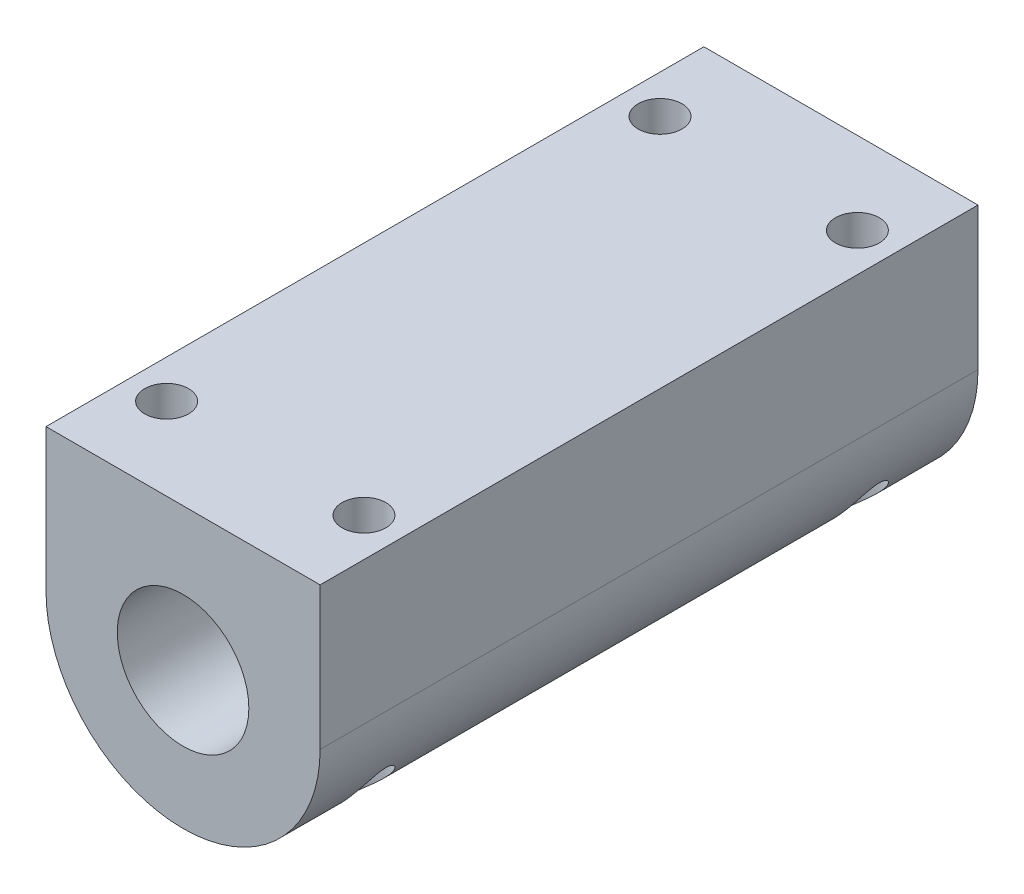
ISO-10303-21;
HEADER;
FILE_DESCRIPTION(('STEP AP214'),'2;1');
FILE_NAME('part.step','',(''),(''),'','','');
FILE_SCHEMA(('AUTOMOTIVE_DESIGN { 1 0 10303 214 1 1 1 1 }'));
ENDSEC;
DATA;
#1=APPLICATION_CONTEXT('core data for automotive mechanical design processes');
#2=APPLICATION_PROTOCOL_DEFINITION('international standard','automotive_design',2000,#1);
#3=PRODUCT_CONTEXT('',#1,'mechanical');
#4=PRODUCT('Part','Part','',(#3));
#5=PRODUCT_RELATED_PRODUCT_CATEGORY('part','',(#4));
#6=PRODUCT_DEFINITION_FORMATION('','',#4);
#7=PRODUCT_DEFINITION_CONTEXT('part definition',#1,'design');
#8=PRODUCT_DEFINITION('design','',#6,#7);
#9=PRODUCT_DEFINITION_SHAPE('','',#8);
#10=(LENGTH_UNIT() NAMED_UNIT(*) SI_UNIT(.MILLI.,.METRE.));
#11=(NAMED_UNIT(*) PLANE_ANGLE_UNIT() SI_UNIT($,.RADIAN.));
#12=(NAMED_UNIT(*) SI_UNIT($,.STERADIAN.) SOLID_ANGLE_UNIT());
#13=UNCERTAINTY_MEASURE_WITH_UNIT(LENGTH_MEASURE(1.E-05),#10,'distance_accuracy_value','');
#14=(GEOMETRIC_REPRESENTATION_CONTEXT(3) GLOBAL_UNCERTAINTY_ASSIGNED_CONTEXT((#13)) GLOBAL_UNIT_ASSIGNED_CONTEXT((#10,
#11,#12)) REPRESENTATION_CONTEXT('',''));
#15=CARTESIAN_POINT('',(0.,0.,0.));
#16=DIRECTION('',(0.,0.,1.));
#17=DIRECTION('',(1.,0.,0.));
#18=AXIS2_PLACEMENT_3D('',#15,#16,#17);
#19=CARTESIAN_POINT('',(0.,0.,60.));
#20=DIRECTION('',(0.,0.,1.));
#21=DIRECTION('',(1.,0.,0.));
#22=AXIS2_PLACEMENT_3D('',#19,#20,#21);
#23=PLANE('',#22);
#24=CARTESIAN_POINT('',(0.,0.,60.));
#25=DIRECTION('',(0.,0.,1.));
#26=DIRECTION('',(1.,0.,0.));
#27=AXIS2_PLACEMENT_3D('',#24,#25,#26);
#28=CIRCLE('',#27,12.5);
#29=CARTESIAN_POINT('',(-12.5,0.,60.));
#30=VERTEX_POINT('',#29);
#31=CARTESIAN_POINT('',(12.5,0.,60.));
#32=VERTEX_POINT('',#31);
#33=EDGE_CURVE('E85',#30,#32,#28,.T.);
#34=ORIENTED_EDGE('',*,*,#33,.T.);
#35=DIRECTION('',(0.,1.,0.));
#36=VECTOR('',#35,1.);
#37=CARTESIAN_POINT('',(12.5,13.,60.));
#38=LINE('',#37,#36);
#39=CARTESIAN_POINT('',(12.5,13.,60.));
#40=VERTEX_POINT('',#39);
#41=EDGE_CURVE('E80',#32,#40,#38,.T.);
#42=ORIENTED_EDGE('',*,*,#41,.T.);
#43=DIRECTION('',(-1.,0.,0.));
#44=VECTOR('',#43,1.);
#45=CARTESIAN_POINT('',(-12.5,13.,60.));
#46=LINE('',#45,#44);
#47=CARTESIAN_POINT('',(-12.5,13.,60.));
#48=VERTEX_POINT('',#47);
#49=EDGE_CURVE('E83',#40,#48,#46,.T.);
#50=ORIENTED_EDGE('',*,*,#49,.T.);
#51=DIRECTION('',(0.,-1.,0.));
#52=VECTOR('',#51,1.);
#53=CARTESIAN_POINT('',(-12.5,0.,60.));
#54=LINE('',#53,#52);
#55=EDGE_CURVE('E50',#48,#30,#54,.T.);
#56=ORIENTED_EDGE('',*,*,#55,.T.);
#57=EDGE_LOOP('',(#34,#42,#50,#56));
#58=FACE_BOUND('',#57,.T.);
#59=CARTESIAN_POINT('',(0.,0.,60.));
#60=DIRECTION('',(0.,0.,1.));
#61=DIRECTION('',(1.,0.,0.));
#62=AXIS2_PLACEMENT_3D('',#59,#60,#61);
#63=CIRCLE('',#62,6.);
#64=CARTESIAN_POINT('',(6.,0.,60.));
#65=VERTEX_POINT('',#64);
#66=EDGE_CURVE('E100',#65,#65,#63,.T.);
#67=ORIENTED_EDGE('',*,*,#66,.F.);
#68=EDGE_LOOP('',(#67));
#69=FACE_BOUND('',#68,.T.);
#70=ADVANCED_FACE('F32',(#58,#69),#23,.T.);
#71=CARTESIAN_POINT('',(0.,0.,0.));
#72=DIRECTION('',(0.,0.,1.));
#73=DIRECTION('',(1.,0.,0.));
#74=AXIS2_PLACEMENT_3D('',#71,#72,#73);
#75=PLANE('',#74);
#76=CARTESIAN_POINT('',(0.,0.,0.));
#77=DIRECTION('',(0.,0.,1.));
#78=DIRECTION('',(1.,0.,0.));
#79=AXIS2_PLACEMENT_3D('',#76,#77,#78);
#80=CIRCLE('',#79,12.5);
#81=CARTESIAN_POINT('',(-12.5,0.,0.));
#82=VERTEX_POINT('',#81);
#83=CARTESIAN_POINT('',(12.5,0.,0.));
#84=VERTEX_POINT('',#83);
#85=EDGE_CURVE('E97',#82,#84,#80,.T.);
#86=ORIENTED_EDGE('',*,*,#85,.F.);
#87=DIRECTION('',(0.,-1.,0.));
#88=VECTOR('',#87,1.);
#89=CARTESIAN_POINT('',(-12.5,0.,0.));
#90=LINE('',#89,#88);
#91=CARTESIAN_POINT('',(-12.5,13.,0.));
#92=VERTEX_POINT('',#91);
#93=EDGE_CURVE('E73',#92,#82,#90,.T.);
#94=ORIENTED_EDGE('',*,*,#93,.F.);
#95=DIRECTION('',(-1.,0.,0.));
#96=VECTOR('',#95,1.);
#97=CARTESIAN_POINT('',(-12.5,13.,0.));
#98=LINE('',#97,#96);
#99=CARTESIAN_POINT('',(12.5,13.,0.));
#100=VERTEX_POINT('',#99);
#101=EDGE_CURVE('E67',#100,#92,#98,.T.);
#102=ORIENTED_EDGE('',*,*,#101,.F.);
#103=DIRECTION('',(0.,1.,0.));
#104=VECTOR('',#103,1.);
#105=CARTESIAN_POINT('',(12.5,13.,0.));
#106=LINE('',#105,#104);
#107=EDGE_CURVE('E89',#84,#100,#106,.T.);
#108=ORIENTED_EDGE('',*,*,#107,.F.);
#109=EDGE_LOOP('',(#86,#94,#102,#108));
#110=FACE_BOUND('',#109,.T.);
#111=CARTESIAN_POINT('',(0.,0.,0.));
#112=DIRECTION('',(0.,0.,1.));
#113=DIRECTION('',(1.,0.,0.));
#114=AXIS2_PLACEMENT_3D('',#111,#112,#113);
#115=CIRCLE('',#114,6.);
#116=CARTESIAN_POINT('',(6.,0.,0.));
#117=VERTEX_POINT('',#116);
#118=EDGE_CURVE('E112',#117,#117,#115,.T.);
#119=ORIENTED_EDGE('',*,*,#118,.T.);
#120=EDGE_LOOP('',(#119));
#121=FACE_BOUND('',#120,.T.);
#122=ADVANCED_FACE('F108',(#110,#121),#75,.F.);
#123=CARTESIAN_POINT('',(0.,0.,60.));
#124=DIRECTION('',(0.,0.,-1.));
#125=DIRECTION('',(-1.,0.,0.));
#126=AXIS2_PLACEMENT_3D('',#123,#124,#125);
#127=CYLINDRICAL_SURFACE('',#126,12.5);
#128=CARTESIAN_POINT('',(-9.,-8.67467578644874,9.5));
#129=CARTESIAN_POINT('',(-8.88276822720846,-8.79630010605995,9.50000229512803));
#130=CARTESIAN_POINT('',(-8.76299370317165,-8.91560878418834,9.48972096332027));
#131=CARTESIAN_POINT('',(-8.52095015980995,-9.14720618643477,9.44566512384027));
#132=CARTESIAN_POINT('',(-8.39868335012853,-9.25950079835037,9.41191061706574));
#133=CARTESIAN_POINT('',(-8.17641141476483,-9.45592013115074,9.32575450178367));
#134=CARTESIAN_POINT('',(-8.07616803637957,-9.54158180236724,9.27751818677145));
#135=CARTESIAN_POINT('',(-7.88018632223849,-9.70406071034824,9.16101530606825));
#136=CARTESIAN_POINT('',(-7.78444297647673,-9.78088792761146,9.09277165890282));
#137=CARTESIAN_POINT('',(-7.61819104126559,-9.91071589020513,8.94929025082109));
#138=CARTESIAN_POINT('',(-7.54621062322196,-9.96552886500069,8.87741102448932));
#139=CARTESIAN_POINT('',(-7.41160635442053,-10.0660390033831,8.71972633580961));
#140=CARTESIAN_POINT('',(-7.34898004293253,-10.111738565446,8.63392454842392));
#141=CARTESIAN_POINT('',(-7.23614358271359,-10.1927971216739,8.44901085231138));
#142=CARTESIAN_POINT('',(-7.18602956467706,-10.2280764147214,8.3498044062846));
#143=CARTESIAN_POINT('',(-7.10229109415836,-10.2864036589674,8.1413148099223));
#144=CARTESIAN_POINT('',(-7.06865390729351,-10.3094610571883,8.03203951931132));
#145=CARTESIAN_POINT('',(-7.02361602430495,-10.3401864928202,7.82228396005547));
#146=CARTESIAN_POINT('',(-7.00987062083992,-10.3494810988241,7.72254014960467));
#147=CARTESIAN_POINT('',(-6.99759379613082,-10.3577867234859,7.52171306741573));
#148=CARTESIAN_POINT('',(-6.99905488687743,-10.3568028035132,7.42063047940983));
#149=CARTESIAN_POINT('',(-7.01644910810808,-10.3450244215283,7.22746244037671));
#150=CARTESIAN_POINT('',(-7.03136813879621,-10.3349173822996,7.135240368689));
#151=CARTESIAN_POINT('',(-7.07345285717876,-10.3061587694468,6.95504510094699));
#152=CARTESIAN_POINT('',(-7.10061810030169,-10.2875075060014,6.86707175078065));
#153=CARTESIAN_POINT('',(-7.16648996053917,-10.2417308566956,6.69573605598136));
#154=CARTESIAN_POINT('',(-7.20542244932194,-10.2144390796019,6.61250575178425));
#155=CARTESIAN_POINT('',(-7.29275884504713,-10.1522675556593,6.4542933382391));
#156=CARTESIAN_POINT('',(-7.34116525708442,-10.1173858015954,6.37931341866767));
#157=CARTESIAN_POINT('',(-7.45053002520933,-10.0371617322873,6.23178460290596));
#158=CARTESIAN_POINT('',(-7.51225047896427,-9.99113292747637,6.16017708274989));
#159=CARTESIAN_POINT('',(-7.64217028192239,-9.89211457976818,6.02865255301249));
#160=CARTESIAN_POINT('',(-7.71037374846463,-9.83912060502906,5.96874304755768));
#161=CARTESIAN_POINT('',(-7.88222908507085,-9.70243135038521,5.83657747209059));
#162=CARTESIAN_POINT('',(-7.98819685562898,-9.61553728072475,5.77061375034848));
#163=CARTESIAN_POINT('',(-8.20366929940789,-9.43238835169646,5.66138229770751));
#164=CARTESIAN_POINT('',(-8.31318024174433,-9.33611621765215,5.6181574265351));
#165=CARTESIAN_POINT('',(-8.56845593375561,-9.10331771328059,5.54117643056265));
#166=CARTESIAN_POINT('',(-8.71412906801426,-8.9640755957418,5.51538799716652));
#167=CARTESIAN_POINT('',(-8.99959956508315,-8.67746114372873,5.49486904229909));
#168=CARTESIAN_POINT('',(-9.13938631922485,-8.53007515160747,5.50019236529519));
#169=CARTESIAN_POINT('',(-9.36027706072209,-8.28562686390642,5.53082088932961));
#170=CARTESIAN_POINT('',(-9.4441193885721,-8.18990816176522,5.54809182740139));
#171=CARTESIAN_POINT('',(-9.60777170721312,-7.99729189445832,5.59269515356984));
#172=CARTESIAN_POINT('',(-9.68758017280723,-7.90039390033337,5.6200313154227));
#173=CARTESIAN_POINT('',(-9.84276131897325,-7.70619961719462,5.68428810854343));
#174=CARTESIAN_POINT('',(-9.91813278318653,-7.60890322671111,5.72121135314046));
#175=CARTESIAN_POINT('',(-10.0640766206137,-7.41478830902916,5.80447635783852));
#176=CARTESIAN_POINT('',(-10.1346511209942,-7.31796958791167,5.85081390641211));
#177=CARTESIAN_POINT('',(-10.2473834457174,-7.15871079720092,5.93565802906032));
#178=CARTESIAN_POINT('',(-10.2910062622466,-7.09583566545886,5.97142437146115));
#179=CARTESIAN_POINT('',(-10.3758757338867,-6.9711465468382,6.04734426896126));
#180=CARTESIAN_POINT('',(-10.4171228901536,-6.90933233809904,6.08749689353975));
#181=CARTESIAN_POINT('',(-10.4969708043723,-6.78740760119963,6.17241954066919));
#182=CARTESIAN_POINT('',(-10.5355767807698,-6.7272938597869,6.217179993129));
#183=CARTESIAN_POINT('',(-10.6099269034737,-6.60941015390056,6.31182697191996));
#184=CARTESIAN_POINT('',(-10.6456725530054,-6.55163896629367,6.36171077381089));
#185=CARTESIAN_POINT('',(-10.7176950030395,-6.43322061434106,6.4731541959483));
#186=CARTESIAN_POINT('',(-10.7535859929172,-6.3729718587271,6.53539554875988));
#187=CARTESIAN_POINT('',(-10.8203144062502,-6.25900429702668,6.66815352138931));
#188=CARTESIAN_POINT('',(-10.8511559604886,-6.20528016274006,6.73866329520069));
#189=CARTESIAN_POINT('',(-10.8991105022521,-6.12055037273699,6.86996465233533));
#190=CARTESIAN_POINT('',(-10.9177221207053,-6.08723709913078,6.9286939732909));
#191=CARTESIAN_POINT('',(-10.9500639085723,-6.02886516889463,7.05138872091212));
#192=CARTESIAN_POINT('',(-10.9638037314902,-6.00379019532729,7.11534348021988));
#193=CARTESIAN_POINT('',(-10.9829606952278,-5.96865937993694,7.23408951726838));
#194=CARTESIAN_POINT('',(-10.9895033478808,-5.95658406985546,7.28809183173876));
#195=CARTESIAN_POINT('',(-10.998131907873,-5.9406381206953,7.39763904332488));
#196=CARTESIAN_POINT('',(-11.0002219701805,-5.93675983253029,7.45318245327071));
#197=CARTESIAN_POINT('',(-10.9997400713806,-5.93765258109292,7.56424370464236));
#198=CARTESIAN_POINT('',(-10.9971625444792,-5.94243394388737,7.61976143647809));
#199=CARTESIAN_POINT('',(-10.9875953617579,-5.96010443226487,7.72910020717337));
#200=CARTESIAN_POINT('',(-10.9806014256311,-5.97300142333113,7.78291954678931));
#201=CARTESIAN_POINT('',(-10.9599236017858,-6.01087908509853,7.90450478256743));
#202=CARTESIAN_POINT('',(-10.9448153067953,-6.03840553857223,7.97122431042418));
#203=CARTESIAN_POINT('',(-10.9093953143967,-6.10216603564548,8.0988507296061));
#204=CARTESIAN_POINT('',(-10.8890711998619,-6.13842084562504,8.15974326719181));
#205=CARTESIAN_POINT('',(-10.8296934787522,-6.24285912140513,8.31419691436404));
#206=CARTESIAN_POINT('',(-10.7871328103128,-6.31632050819917,8.4027873143742));
#207=CARTESIAN_POINT('',(-10.6942838885477,-6.47229697409642,8.56691769348725));
#208=CARTESIAN_POINT('',(-10.6439737227844,-6.55483753005958,8.64241933443456));
#209=CARTESIAN_POINT('',(-10.542729793926,-6.71632279648207,8.77522567711877));
#210=CARTESIAN_POINT('',(-10.4923883027946,-6.79476915490361,8.83360227179183));
#211=CARTESIAN_POINT('',(-10.3873875324005,-6.95422939358136,8.94252653332933));
#212=CARTESIAN_POINT('',(-10.3327250974372,-7.03524512397382,8.99306839700875));
#213=CARTESIAN_POINT('',(-10.2194405418105,-7.19881570063628,9.08693980871759));
#214=CARTESIAN_POINT('',(-10.1608140829544,-7.28137215914936,9.13026126916471));
#215=CARTESIAN_POINT('',(-10.039914919325,-7.44719015286643,9.20991714839595));
#216=CARTESIAN_POINT('',(-9.97764173958736,-7.53045177870101,9.24625065438724));
#217=CARTESIAN_POINT('',(-9.84464111811056,-7.70362745041632,9.31455220777258));
#218=CARTESIAN_POINT('',(-9.77363376535733,-7.79355060489168,9.3459536275022));
#219=CARTESIAN_POINT('',(-9.62788040719201,-7.97290897911729,9.40047907902829));
#220=CARTESIAN_POINT('',(-9.55313366738266,-8.06234409916454,9.42360147753443));
#221=CARTESIAN_POINT('',(-9.40035593694999,-8.23996346427965,9.4610938259245));
#222=CARTESIAN_POINT('',(-9.32233133749284,-8.3281497327117,9.47548003342051));
#223=CARTESIAN_POINT('',(-9.16328853701706,-8.50282937887128,9.49493220443343));
#224=CARTESIAN_POINT('',(-9.08227040715237,-8.58932279676191,9.49999838933497));
#225=CARTESIAN_POINT('',(-9.,-8.67467578644874,9.5));
#226=B_SPLINE_CURVE_WITH_KNOTS('',3,(#128,#129,#130,#131,#132,#133,#134,#135,#136,#137,#138,
#139,#140,#141,#142,#143,#144,#145,#146,#147,#148,#149,#150,#151,#152,#153,#154,#155,#156,#157,
#158,#159,#160,#161,#162,#163,#164,#165,#166,#167,#168,#169,#170,#171,#172,#173,#174,#175,#176,
#177,#178,#179,#180,#181,#182,#183,#184,#185,#186,#187,#188,#189,#190,#191,#192,#193,#194,#195,
#196,#197,#198,#199,#200,#201,#202,#203,#204,#205,#206,#207,#208,#209,#210,#211,#212,#213,#214,
#215,#216,#217,#218,#219,#220,#221,#222,#223,#224,#225),.UNSPECIFIED.,.T.,.F.,(4,2,2,2,2,2,2,2,
2,2,2,2,2,2,2,2,2,2,2,2,2,2,2,2,2,2,2,2,2,2,2,2,2,2,2,2,2,2,2,2,2,2,2,2,2,2,2,2,4),(0.,
0.506515561333398,1.01260006156559,1.43231811599233,1.85155724686974,2.19682589090271,
2.54200354655237,2.88975676699341,3.23724079506003,3.53897170138905,3.84055403587292,
4.12115100602486,4.40173779054828,4.68809516572368,4.97452836206757,5.28874694002593,
5.60316642770503,6.05690998935776,6.51150576070807,7.11773648474762,7.72501670998574,
8.10983390168315,8.49479552012157,8.87986218506367,9.26475696666356,9.5180403170384,
9.77127003898941,10.023984046223,10.2765643569345,10.5573289242931,10.8378626468239,
11.0473381465395,11.2563962181266,11.4228463292391,11.5891410480116,11.7556341929211,
11.9222889482683,12.1422583109251,12.3627562853539,12.7288160896204,13.0959306357697,
13.4254232569892,13.7551587790815,14.08526119171,14.4154066943119,14.7714700291946,
15.1276035698144,15.4830723164542,15.8385326193024),.UNSPECIFIED.);
#227=CARTESIAN_POINT('',(-9.,-8.67467578644874,9.5));
#228=VERTEX_POINT('',#227);
#229=EDGE_CURVE('E115',#228,#228,#226,.T.);
#230=ORIENTED_EDGE('',*,*,#229,.T.);
#231=EDGE_LOOP('',(#230));
#232=FACE_BOUND('',#231,.T.);
#233=CARTESIAN_POINT('',(9.,-8.67467578644874,54.5));
#234=CARTESIAN_POINT('',(9.08396611585732,-8.58756195541514,54.4999998704079));
#235=CARTESIAN_POINT('',(9.16664430839451,-8.49924510909769,54.4947206574689));
#236=CARTESIAN_POINT('',(9.32887045365784,-8.32085993475654,54.4744688217737));
#237=CARTESIAN_POINT('',(9.40841798979009,-8.23079137600064,54.4594949135477));
#238=CARTESIAN_POINT('',(9.56433074349658,-8.04909823946299,54.4204226210362));
#239=CARTESIAN_POINT('',(9.64067811603983,-7.95746814242235,54.3962791134116));
#240=CARTESIAN_POINT('',(9.78942705401799,-7.77374328841146,54.3393331795191));
#241=CARTESIAN_POINT('',(9.86182955877971,-7.68164864781217,54.3065328255311));
#242=CARTESIAN_POINT('',(10.004236204174,-7.49528911398072,54.2315178893137));
#243=CARTESIAN_POINT('',(10.0741311292985,-7.40102917091493,54.1890833335201));
#244=CARTESIAN_POINT('',(10.2092281439921,-7.21352989143371,54.0951624607035));
#245=CARTESIAN_POINT('',(10.2744271282237,-7.12029126432466,54.0436702300798));
#246=CARTESIAN_POINT('',(10.3992605115671,-6.93668706860281,53.931459113647));
#247=CARTESIAN_POINT('',(10.4589269299754,-6.84630726205492,53.8707994645657));
#248=CARTESIAN_POINT('',(10.5724036393126,-6.66972524227946,53.7389964944674));
#249=CARTESIAN_POINT('',(10.6262235125799,-6.58351632576573,53.6678707918171));
#250=CARTESIAN_POINT('',(10.7090553538288,-6.44748572245681,53.5405193429663));
#251=CARTESIAN_POINT('',(10.7401205482477,-6.39555715410411,53.4878901812524));
#252=CARTESIAN_POINT('',(10.7987363357556,-6.29607962440472,53.3766451411476));
#253=CARTESIAN_POINT('',(10.8262833068718,-6.24853519025017,53.3180232032409));
#254=CARTESIAN_POINT('',(10.877167048307,-6.1595364938398,53.193418545641));
#255=CARTESIAN_POINT('',(10.900453291448,-6.11815628310664,53.1273608421909));
#256=CARTESIAN_POINT('',(10.9408633914827,-6.04559665523225,52.9881150200447));
#257=CARTESIAN_POINT('',(10.9580057208483,-6.01438668607896,52.9149491307741));
#258=CARTESIAN_POINT('',(10.9801161111745,-5.97389412101293,52.786315793708));
#259=CARTESIAN_POINT('',(10.9872124893038,-5.96081053370404,52.7324234415455));
#260=CARTESIAN_POINT('',(10.9969735040856,-5.94278414175488,52.6229101952518));
#261=CARTESIAN_POINT('',(10.9996431500172,-5.93783213549951,52.5672913275768));
#262=CARTESIAN_POINT('',(11.0002900893108,-5.93663364058271,52.4558190943156));
#263=CARTESIAN_POINT('',(10.9982580978573,-5.94040437763217,52.3999654825224));
#264=CARTESIAN_POINT('',(10.9896927140494,-5.95623460506215,52.2897953529982));
#265=CARTESIAN_POINT('',(10.9831549249385,-5.96830219147916,52.2354803906248));
#266=CARTESIAN_POINT('',(10.9636799605741,-6.00401841392167,52.1143397356695));
#267=CARTESIAN_POINT('',(10.9494411420193,-6.03000302380452,52.0484224126305));
#268=CARTESIAN_POINT('',(10.9158230220888,-6.09064972465464,51.9221442293547));
#269=CARTESIAN_POINT('',(10.8964320307885,-6.12533153879579,51.8617964308863));
#270=CARTESIAN_POINT('',(10.8399635322882,-6.22496533776284,51.7095935152106));
#271=CARTESIAN_POINT('',(10.7995256814168,-6.2950519630468,51.6223974706993));
#272=CARTESIAN_POINT('',(10.711146182078,-6.44429638869356,51.4605258126995));
#273=CARTESIAN_POINT('',(10.6631828770899,-6.52348018682676,51.3858876641139));
#274=CARTESIAN_POINT('',(10.5663039907705,-6.67913209226478,51.253924062242));
#275=CARTESIAN_POINT('',(10.5179302080224,-6.75512087245879,51.1956220641639));
#276=CARTESIAN_POINT('',(10.4169859130619,-6.90977162684832,51.0866091145755));
#277=CARTESIAN_POINT('',(10.3644122588723,-6.98843557662314,51.0359039294399));
#278=CARTESIAN_POINT('',(10.2554425656865,-7.14739078862358,50.9414547264753));
#279=CARTESIAN_POINT('',(10.1990430298693,-7.22768349123208,50.8977172026611));
#280=CARTESIAN_POINT('',(10.0827247286301,-7.38908416080602,50.8169310811628));
#281=CARTESIAN_POINT('',(10.0228054896968,-7.47019223624269,50.7798833862162));
#282=CARTESIAN_POINT('',(9.89568062313468,-7.63788350405202,50.7102118669468));
#283=CARTESIAN_POINT('',(9.82825427397129,-7.7244827345817,50.6780269135393));
#284=CARTESIAN_POINT('',(9.68989805380928,-7.89735229597779,50.621268625145));
#285=CARTESIAN_POINT('',(9.61896764806076,-7.98362257446582,50.5966964561228));
#286=CARTESIAN_POINT('',(9.4014160837757,-8.24096738599999,50.5349065576564));
#287=CARTESIAN_POINT('',(9.24977499374283,-8.41092020444197,50.5094720266227));
#288=CARTESIAN_POINT('',(8.96531771726607,-8.71251660195061,50.4962110629428));
#289=CARTESIAN_POINT('',(8.83415368393088,-8.84546695414292,50.502339654923));
#290=CARTESIAN_POINT('',(8.56812671842283,-9.10336691664655,50.5425710428504));
#291=CARTESIAN_POINT('',(8.43326847318984,-9.22832604997053,50.5766398470133));
#292=CARTESIAN_POINT('',(8.19659634931338,-9.43847086690331,50.6651874290728));
#293=CARTESIAN_POINT('',(8.09446580013591,-9.52610168753512,50.7129869621914));
#294=CARTESIAN_POINT('',(7.894643566136,-9.69233690446613,50.829221983417));
#295=CARTESIAN_POINT('',(7.79694607079444,-9.77095333556752,50.8976295049946));
#296=CARTESIAN_POINT('',(7.6283233149342,-9.90292611297347,51.0411142477119));
#297=CARTESIAN_POINT('',(7.55581987635828,-9.95825187927439,51.1125133359664));
#298=CARTESIAN_POINT('',(7.42006029439335,-10.0598152880322,51.269338603357));
#299=CARTESIAN_POINT('',(7.35680191195286,-10.1060551319378,51.3547613754335));
#300=CARTESIAN_POINT('',(7.24260671162457,-10.1882117557378,51.5390622697752));
#301=CARTESIAN_POINT('',(7.191766047567,-10.2240483590677,51.6380366707337));
#302=CARTESIAN_POINT('',(7.10653173033917,-10.283479053978,51.8462454435426));
#303=CARTESIAN_POINT('',(7.07212517193264,-10.3070827529535,51.9554716839949));
#304=CARTESIAN_POINT('',(7.02566671618258,-10.3387952945727,52.1653267118623));
#305=CARTESIAN_POINT('',(7.01126844856814,-10.3485347357335,52.2651947237717));
#306=CARTESIAN_POINT('',(6.99774610978457,-10.3576844064374,52.4664114965126));
#307=CARTESIAN_POINT('',(6.99861439467258,-10.3570998052143,52.5677594909207));
#308=CARTESIAN_POINT('',(7.01494227103055,-10.3460456634354,52.7613596914083));
#309=CARTESIAN_POINT('',(7.02935447662036,-10.3362856601526,52.8537442515712));
#310=CARTESIAN_POINT('',(7.07048138961973,-10.3081961346476,53.0343546899327));
#311=CARTESIAN_POINT('',(7.09719559555018,-10.2898669617389,53.1225807374874));
#312=CARTESIAN_POINT('',(7.16217699019941,-10.2447451251132,53.2943559753193));
#313=CARTESIAN_POINT('',(7.20065336376594,-10.2177987716184,53.3777849718643));
#314=CARTESIAN_POINT('',(7.28713275045033,-10.1563037489985,53.5364651751801));
#315=CARTESIAN_POINT('',(7.33513806976615,-10.1217532392929,53.6117143954428));
#316=CARTESIAN_POINT('',(7.44365275935102,-10.0422586557355,53.7597579753456));
#317=CARTESIAN_POINT('',(7.50491858823582,-9.9966369438982,53.8316308857045));
#318=CARTESIAN_POINT('',(7.63399797043613,-9.89841785525626,53.9637584551101));
#319=CARTESIAN_POINT('',(7.70181612482452,-9.84581556683404,54.0240048596737));
#320=CARTESIAN_POINT('',(7.87261306551824,-9.71022294029157,54.1568949691535));
#321=CARTESIAN_POINT('',(7.97792473008284,-9.62405098570133,54.2233161953011));
#322=CARTESIAN_POINT('',(8.19219139792747,-9.44234208289505,54.3335820559509));
#323=CARTESIAN_POINT('',(8.30115186696555,-9.34679062949615,54.377391045033));
#324=CARTESIAN_POINT('',(8.50975793974148,-9.15708619751716,54.441791653343));
#325=CARTESIAN_POINT('',(8.60941836658724,-9.06348800151461,54.4640222955292));
#326=CARTESIAN_POINT('',(8.80661092414753,-8.87200540544789,54.4931203872777));
#327=CARTESIAN_POINT('',(8.90414469818269,-8.77412450431462,54.5000001479417));
#328=CARTESIAN_POINT('',(9.,-8.67467578644874,54.5));
#329=B_SPLINE_CURVE_WITH_KNOTS('',3,(#233,#234,#235,#236,#237,#238,#239,#240,#241,#242,#243,
#244,#245,#246,#247,#248,#249,#250,#251,#252,#253,#254,#255,#256,#257,#258,#259,#260,#261,#262,
#263,#264,#265,#266,#267,#268,#269,#270,#271,#272,#273,#274,#275,#276,#277,#278,#279,#280,#281,
#282,#283,#284,#285,#286,#287,#288,#289,#290,#291,#292,#293,#294,#295,#296,#297,#298,#299,#300,
#301,#302,#303,#304,#305,#306,#307,#308,#309,#310,#311,#312,#313,#314,#315,#316,#317,#318,#319,
#320,#321,#322,#323,#324,#325,#326,#327,#328),.UNSPECIFIED.,.T.,.F.,(4,2,2,2,2,2,2,2,2,2,2,2,2,
2,2,2,2,2,2,2,2,2,2,2,2,2,2,2,2,2,2,2,2,2,2,2,2,2,2,2,2,2,2,2,2,2,2,4),(0.,0.362823232927906,
0.725694584317411,1.09037525090398,1.45496869911318,1.82891768067206,2.20311171946947,
2.57498377891346,2.94623684918253,3.18650734862741,3.42702324357654,3.67022880248416,
3.91269687377121,4.07973442516811,4.24658282797261,4.41376100492597,4.58110254571866,
4.79669507889956,5.01278101690028,5.36765792967865,5.72357548881787,6.04503360429672,
6.36673450022844,6.68873349616687,7.01077591079874,7.35356918538551,7.69641493583069,
8.38075575237862,8.93951210921592,9.49758969527554,9.92449681293584,10.3508271768084,
10.6969227842547,11.04293443173,11.3915459589356,11.7398832795038,12.0423697448277,
12.3447047598892,12.6254296307372,12.9061430591211,13.192171984698,13.4782702196595,
13.7917030477083,14.1053575918785,14.5571249991203,15.0096024038841,15.4241321731358,
15.8383293780862),.UNSPECIFIED.);
#330=CARTESIAN_POINT('',(9.,-8.67467578644874,54.5));
#331=VERTEX_POINT('',#330);
#332=EDGE_CURVE('E123',#331,#331,#329,.T.);
#333=ORIENTED_EDGE('',*,*,#332,.T.);
#334=EDGE_LOOP('',(#333));
#335=FACE_BOUND('',#334,.T.);
#336=CARTESIAN_POINT('',(9.,-8.67467578644874,9.5));
#337=CARTESIAN_POINT('',(9.08396611585732,-8.58756195541514,9.49999987040794));
#338=CARTESIAN_POINT('',(9.16664430839451,-8.49924510909769,9.49472065746894));
#339=CARTESIAN_POINT('',(9.32887045365784,-8.32085993475654,9.4744688217737));
#340=CARTESIAN_POINT('',(9.40841798979009,-8.23079137600064,9.45949491354774));
#341=CARTESIAN_POINT('',(9.56433074349658,-8.04909823946299,9.42042262103623));
#342=CARTESIAN_POINT('',(9.64067811603983,-7.95746814242235,9.39627911341164));
#343=CARTESIAN_POINT('',(9.78942705401799,-7.77374328841146,9.33933317951908));
#344=CARTESIAN_POINT('',(9.86182955877971,-7.68164864781217,9.30653282553112));
#345=CARTESIAN_POINT('',(10.004236204174,-7.49528911398073,9.23151788931367));
#346=CARTESIAN_POINT('',(10.0741311292985,-7.40102917091493,9.18908333352005));
#347=CARTESIAN_POINT('',(10.2092281439921,-7.21352989143371,9.09516246070351));
#348=CARTESIAN_POINT('',(10.2744271282237,-7.12029126432466,9.04367023007984));
#349=CARTESIAN_POINT('',(10.3992605115671,-6.93668706860282,8.93145911364697));
#350=CARTESIAN_POINT('',(10.4589269299754,-6.84630726205492,8.87079946456572));
#351=CARTESIAN_POINT('',(10.5724036393126,-6.66972524227945,8.73899649446739));
#352=CARTESIAN_POINT('',(10.6262235125799,-6.58351632576573,8.66787079181712));
#353=CARTESIAN_POINT('',(10.7090553538288,-6.44748572245681,8.54051934296635));
#354=CARTESIAN_POINT('',(10.7401205482477,-6.39555715410411,8.48789018125238));
#355=CARTESIAN_POINT('',(10.7987363357556,-6.29607962440472,8.37664514114764));
#356=CARTESIAN_POINT('',(10.8262833068718,-6.24853519025017,8.31802320324093));
#357=CARTESIAN_POINT('',(10.877167048307,-6.1595364938398,8.19341854564098));
#358=CARTESIAN_POINT('',(10.900453291448,-6.11815628310664,8.12736084219087));
#359=CARTESIAN_POINT('',(10.9408633914827,-6.04559665523225,7.98811502004471));
#360=CARTESIAN_POINT('',(10.9580057208483,-6.01438668607896,7.91494913077407));
#361=CARTESIAN_POINT('',(10.9801161111745,-5.97389412101294,7.78631579370802));
#362=CARTESIAN_POINT('',(10.9872124893038,-5.96081053370404,7.73242344154555));
#363=CARTESIAN_POINT('',(10.9969735040856,-5.94278414175488,7.6229101952518));
#364=CARTESIAN_POINT('',(10.9996431500172,-5.93783213549951,7.56729132757679));
#365=CARTESIAN_POINT('',(11.0002900893108,-5.93663364058271,7.45581909431558));
#366=CARTESIAN_POINT('',(10.9982580978573,-5.94040437763217,7.39996548252242));
#367=CARTESIAN_POINT('',(10.9896927140494,-5.95623460506215,7.28979535299817));
#368=CARTESIAN_POINT('',(10.9831549249385,-5.96830219147916,7.23548039062478));
#369=CARTESIAN_POINT('',(10.9636799605741,-6.00401841392166,7.11433973566949));
#370=CARTESIAN_POINT('',(10.9494411420193,-6.03000302380452,7.04842241263046));
#371=CARTESIAN_POINT('',(10.9158230220888,-6.09064972465464,6.92214422935467));
#372=CARTESIAN_POINT('',(10.8964320307885,-6.12533153879579,6.86179643088633));
#373=CARTESIAN_POINT('',(10.8399635322882,-6.22496533776283,6.70959351521058));
#374=CARTESIAN_POINT('',(10.7995256814168,-6.29505196304679,6.6223974706993));
#375=CARTESIAN_POINT('',(10.711146182078,-6.44429638869355,6.46052581269955));
#376=CARTESIAN_POINT('',(10.6631828770899,-6.52348018682675,6.38588766411386));
#377=CARTESIAN_POINT('',(10.5663039907705,-6.67913209226478,6.25392406224205));
#378=CARTESIAN_POINT('',(10.5179302080224,-6.75512087245878,6.19562206416392));
#379=CARTESIAN_POINT('',(10.4169859130619,-6.90977162684831,6.08660911457551));
#380=CARTESIAN_POINT('',(10.3644122588723,-6.98843557662313,6.03590392943991));
#381=CARTESIAN_POINT('',(10.2554425656865,-7.14739078862357,5.94145472647535));
#382=CARTESIAN_POINT('',(10.1990430298693,-7.22768349123207,5.89771720266106));
#383=CARTESIAN_POINT('',(10.0827247286301,-7.389084160806,5.81693108116285));
#384=CARTESIAN_POINT('',(10.0228054896969,-7.47019223624267,5.77988338621622));
#385=CARTESIAN_POINT('',(9.8956806231347,-7.637883504052,5.71021186694678));
#386=CARTESIAN_POINT('',(9.82825427397131,-7.72448273458167,5.67802691353926));
#387=CARTESIAN_POINT('',(9.6898980538093,-7.89735229597776,5.62126862514505));
#388=CARTESIAN_POINT('',(9.61896764806078,-7.9836225744658,5.59669645612277));
#389=CARTESIAN_POINT('',(9.40141608377572,-8.24096738599996,5.53490655765638));
#390=CARTESIAN_POINT('',(9.24977499374285,-8.41092020444195,5.50947202662271));
#391=CARTESIAN_POINT('',(8.96531771726609,-8.71251660195059,5.49621106294284));
#392=CARTESIAN_POINT('',(8.83415368393089,-8.8454669541429,5.50233965492296));
#393=CARTESIAN_POINT('',(8.56812671842285,-9.10336691664653,5.54257104285036));
#394=CARTESIAN_POINT('',(8.43326847318985,-9.22832604997051,5.57663984701328));
#395=CARTESIAN_POINT('',(8.1965963493134,-9.43847086690329,5.66518742907276));
#396=CARTESIAN_POINT('',(8.09446580013593,-9.52610168753511,5.71298696219137));
#397=CARTESIAN_POINT('',(7.89464356613601,-9.69233690446612,5.82922198341699));
#398=CARTESIAN_POINT('',(7.79694607079446,-9.77095333556752,5.89762950499457));
#399=CARTESIAN_POINT('',(7.62832331493421,-9.90292611297346,6.04111424771189));
#400=CARTESIAN_POINT('',(7.55581987635829,-9.95825187927438,6.1125133359664));
#401=CARTESIAN_POINT('',(7.42006029439336,-10.0598152880322,6.26933860335703));
#402=CARTESIAN_POINT('',(7.35680191195287,-10.1060551319377,6.35476137543345));
#403=CARTESIAN_POINT('',(7.24260671162458,-10.1882117557378,6.53906226977521));
#404=CARTESIAN_POINT('',(7.191766047567,-10.2240483590677,6.63803667073365));
#405=CARTESIAN_POINT('',(7.10653173033917,-10.283479053978,6.84624544354254));
#406=CARTESIAN_POINT('',(7.07212517193264,-10.3070827529535,6.95547168399486));
#407=CARTESIAN_POINT('',(7.02566671618258,-10.3387952945727,7.1653267118623));
#408=CARTESIAN_POINT('',(7.01126844856814,-10.3485347357335,7.26519472377171));
#409=CARTESIAN_POINT('',(6.99774610978457,-10.3576844064374,7.46641149651258));
#410=CARTESIAN_POINT('',(6.99861439467258,-10.3570998052143,7.56775949092071));
#411=CARTESIAN_POINT('',(7.01494227103054,-10.3460456634354,7.76135969140828));
#412=CARTESIAN_POINT('',(7.02935447662036,-10.3362856601526,7.85374425157118));
#413=CARTESIAN_POINT('',(7.07048138961972,-10.3081961346476,8.03435468993265));
#414=CARTESIAN_POINT('',(7.09719559555017,-10.2898669617389,8.12258073748736));
#415=CARTESIAN_POINT('',(7.1621769901994,-10.2447451251132,8.29435597531927));
#416=CARTESIAN_POINT('',(7.20065336376593,-10.2177987716184,8.37778497186428));
#417=CARTESIAN_POINT('',(7.28713275045032,-10.1563037489985,8.53646517518006));
#418=CARTESIAN_POINT('',(7.33513806976614,-10.1217532392929,8.61171439544283));
#419=CARTESIAN_POINT('',(7.443652759351,-10.0422586557355,8.75975797534561));
#420=CARTESIAN_POINT('',(7.50491858823581,-9.9966369438982,8.83163088570451));
#421=CARTESIAN_POINT('',(7.63399797043612,-9.89841785525627,8.96375845511009));
#422=CARTESIAN_POINT('',(7.70181612482451,-9.84581556683406,9.02400485967365));
#423=CARTESIAN_POINT('',(7.87261306551823,-9.71022294029158,9.15689496915349));
#424=CARTESIAN_POINT('',(7.97792473008283,-9.62405098570134,9.22331619530109));
#425=CARTESIAN_POINT('',(8.19219139792745,-9.44234208289507,9.33358205595094));
#426=CARTESIAN_POINT('',(8.30115186696553,-9.34679062949616,9.37739104503303));
#427=CARTESIAN_POINT('',(8.50975793974147,-9.15708619751718,9.44179165334296));
#428=CARTESIAN_POINT('',(8.60941836658723,-9.06348800151462,9.46402229552917));
#429=CARTESIAN_POINT('',(8.80661092414752,-8.8720054054479,9.49312038727767));
#430=CARTESIAN_POINT('',(8.90414469818268,-8.77412450431462,9.50000014794166));
#431=CARTESIAN_POINT('',(9.,-8.67467578644874,9.5));
#432=B_SPLINE_CURVE_WITH_KNOTS('',3,(#336,#337,#338,#339,#340,#341,#342,#343,#344,#345,#346,
#347,#348,#349,#350,#351,#352,#353,#354,#355,#356,#357,#358,#359,#360,#361,#362,#363,#364,#365,
#366,#367,#368,#369,#370,#371,#372,#373,#374,#375,#376,#377,#378,#379,#380,#381,#382,#383,#384,
#385,#386,#387,#388,#389,#390,#391,#392,#393,#394,#395,#396,#397,#398,#399,#400,#401,#402,#403,
#404,#405,#406,#407,#408,#409,#410,#411,#412,#413,#414,#415,#416,#417,#418,#419,#420,#421,#422,
#423,#424,#425,#426,#427,#428,#429,#430,#431),.UNSPECIFIED.,.T.,.F.,(4,2,2,2,2,2,2,2,2,2,2,2,2,
2,2,2,2,2,2,2,2,2,2,2,2,2,2,2,2,2,2,2,2,2,2,2,2,2,2,2,2,2,2,2,2,2,2,4),(0.,0.362823232927906,
0.725694584317411,1.09037525090398,1.45496869911318,1.82891768067206,2.20311171946947,
2.57498377891346,2.94623684918253,3.18650734862741,3.42702324357654,3.67022880248416,
3.91269687377121,4.07973442516811,4.24658282797261,4.41376100492598,4.58110254571866,
4.79669507889956,5.01278101690027,5.36765792967864,5.72357548881787,6.04503360429671,
6.36673450022843,6.68873349616685,7.01077591079872,7.35356918538548,7.69641493583066,
8.38075575237859,8.9395121092159,9.49758969527552,9.92449681293582,10.3508271768084,
10.6969227842547,11.04293443173,11.3915459589356,11.7398832795038,12.0423697448277,
12.3447047598892,12.6254296307372,12.906143059121,13.192171984698,13.4782702196595,
13.7917030477083,14.1053575918785,14.5571249991203,15.0096024038841,15.4241321731358,
15.8383293780862),.UNSPECIFIED.);
#433=CARTESIAN_POINT('',(9.,-8.67467578644874,9.5));
#434=VERTEX_POINT('',#433);
#435=EDGE_CURVE('E153',#434,#434,#432,.T.);
#436=ORIENTED_EDGE('',*,*,#435,.T.);
#437=EDGE_LOOP('',(#436));
#438=FACE_BOUND('',#437,.T.);
#439=CARTESIAN_POINT('',(-9.,-8.67467578644874,54.5));
#440=CARTESIAN_POINT('',(-8.88276822720846,-8.79630010605995,54.500002295128));
#441=CARTESIAN_POINT('',(-8.76299370317165,-8.91560878418834,54.4897209633203));
#442=CARTESIAN_POINT('',(-8.52095015980995,-9.14720618643477,54.4456651238403));
#443=CARTESIAN_POINT('',(-8.39868335012853,-9.25950079835037,54.4119106170657));
#444=CARTESIAN_POINT('',(-8.17641141476483,-9.45592013115074,54.3257545017837));
#445=CARTESIAN_POINT('',(-8.07616803637957,-9.54158180236724,54.2775181867715));
#446=CARTESIAN_POINT('',(-7.88018632223849,-9.70406071034825,54.1610153060682));
#447=CARTESIAN_POINT('',(-7.78444297647673,-9.78088792761147,54.0927716589028));
#448=CARTESIAN_POINT('',(-7.61819104126558,-9.91071589020513,53.9492902508211));
#449=CARTESIAN_POINT('',(-7.54621062322196,-9.96552886500069,53.8774110244893));
#450=CARTESIAN_POINT('',(-7.41160635442052,-10.0660390033831,53.7197263358096));
#451=CARTESIAN_POINT('',(-7.34898004293252,-10.111738565446,53.6339245484239));
#452=CARTESIAN_POINT('',(-7.23614358271358,-10.1927971216739,53.4490108523114));
#453=CARTESIAN_POINT('',(-7.18602956467705,-10.2280764147214,53.3498044062846));
#454=CARTESIAN_POINT('',(-7.10229109415835,-10.2864036589674,53.1413148099223));
#455=CARTESIAN_POINT('',(-7.06865390729351,-10.3094610571884,53.0320395193113));
#456=CARTESIAN_POINT('',(-7.02361602430495,-10.3401864928202,52.8222839600555));
#457=CARTESIAN_POINT('',(-7.00987062083991,-10.3494810988241,52.7225401496047));
#458=CARTESIAN_POINT('',(-6.99759379613082,-10.3577867234859,52.5217130674157));
#459=CARTESIAN_POINT('',(-6.99905488687743,-10.3568028035132,52.4206304794098));
#460=CARTESIAN_POINT('',(-7.01644910810809,-10.3450244215283,52.2274624403767));
#461=CARTESIAN_POINT('',(-7.03136813879621,-10.3349173822996,52.135240368689));
#462=CARTESIAN_POINT('',(-7.07345285717876,-10.3061587694468,51.955045100947));
#463=CARTESIAN_POINT('',(-7.10061810030169,-10.2875075060014,51.8670717507806));
#464=CARTESIAN_POINT('',(-7.16648996053918,-10.2417308566956,51.6957360559813));
#465=CARTESIAN_POINT('',(-7.20542244932195,-10.2144390796019,51.6125057517842));
#466=CARTESIAN_POINT('',(-7.29275884504713,-10.1522675556593,51.4542933382391));
#467=CARTESIAN_POINT('',(-7.34116525708443,-10.1173858015953,51.3793134186676));
#468=CARTESIAN_POINT('',(-7.45053002520934,-10.0371617322873,51.2317846029059));
#469=CARTESIAN_POINT('',(-7.51225047896428,-9.99113292747636,51.1601770827499));
#470=CARTESIAN_POINT('',(-7.6421702819224,-9.89211457976817,51.0286525530125));
#471=CARTESIAN_POINT('',(-7.71037374846465,-9.83912060502906,50.9687430475577));
#472=CARTESIAN_POINT('',(-7.88222908507086,-9.7024313503852,50.8365774720906));
#473=CARTESIAN_POINT('',(-7.988196855629,-9.61553728072474,50.7706137503485));
#474=CARTESIAN_POINT('',(-8.20366929940791,-9.43238835169644,50.6613822977075));
#475=CARTESIAN_POINT('',(-8.31318024174435,-9.33611621765214,50.6181574265351));
#476=CARTESIAN_POINT('',(-8.56845593375563,-9.10331771328057,50.5411764305626));
#477=CARTESIAN_POINT('',(-8.71412906801428,-8.96407559574178,50.5153879971665));
#478=CARTESIAN_POINT('',(-8.99959956508317,-8.67746114372871,50.4948690422991));
#479=CARTESIAN_POINT('',(-9.13938631922488,-8.53007515160745,50.5001923652952));
#480=CARTESIAN_POINT('',(-9.36027706072212,-8.28562686390639,50.5308208893296));
#481=CARTESIAN_POINT('',(-9.44411938857212,-8.18990816176519,50.5480918274014));
#482=CARTESIAN_POINT('',(-9.60777170721314,-7.99729189445829,50.5926951535698));
#483=CARTESIAN_POINT('',(-9.68758017280725,-7.90039390033334,50.6200313154227));
#484=CARTESIAN_POINT('',(-9.84276131897327,-7.7061996171946,50.6842881085434));
#485=CARTESIAN_POINT('',(-9.91813278318655,-7.60890322671108,50.7212113531405));
#486=CARTESIAN_POINT('',(-10.0640766206137,-7.41478830902913,50.8044763578385));
#487=CARTESIAN_POINT('',(-10.1346511209943,-7.31796958791164,50.8508139064121));
#488=CARTESIAN_POINT('',(-10.2473834457175,-7.15871079720089,50.9356580290603));
#489=CARTESIAN_POINT('',(-10.2910062622466,-7.09583566545884,50.9714243714612));
#490=CARTESIAN_POINT('',(-10.3758757338867,-6.97114654683818,51.0473442689613));
#491=CARTESIAN_POINT('',(-10.4171228901537,-6.90933233809903,51.0874968935398));
#492=CARTESIAN_POINT('',(-10.4969708043723,-6.78740760119962,51.1724195406692));
#493=CARTESIAN_POINT('',(-10.5355767807698,-6.72729385978689,51.217179993129));
#494=CARTESIAN_POINT('',(-10.6099269034737,-6.60941015390055,51.31182697192));
#495=CARTESIAN_POINT('',(-10.6456725530054,-6.55163896629367,51.3617107738109));
#496=CARTESIAN_POINT('',(-10.7176950030395,-6.43322061434105,51.4731541959483));
#497=CARTESIAN_POINT('',(-10.7535859929172,-6.37297185872709,51.5353955487599));
#498=CARTESIAN_POINT('',(-10.8203144062502,-6.25900429702667,51.6681535213893));
#499=CARTESIAN_POINT('',(-10.8511559604886,-6.20528016274004,51.7386632952007));
#500=CARTESIAN_POINT('',(-10.8991105022521,-6.12055037273698,51.8699646523353));
#501=CARTESIAN_POINT('',(-10.9177221207053,-6.08723709913077,51.9286939732909));
#502=CARTESIAN_POINT('',(-10.9500639085723,-6.02886516889462,52.0513887209121));
#503=CARTESIAN_POINT('',(-10.9638037314902,-6.00379019532729,52.1153434802199));
#504=CARTESIAN_POINT('',(-10.9829606952278,-5.96865937993694,52.2340895172684));
#505=CARTESIAN_POINT('',(-10.9895033478808,-5.95658406985546,52.2880918317388));
#506=CARTESIAN_POINT('',(-10.998131907873,-5.9406381206953,52.3976390433249));
#507=CARTESIAN_POINT('',(-11.0002219701805,-5.93675983253028,52.4531824532707));
#508=CARTESIAN_POINT('',(-10.9997400713806,-5.93765258109292,52.5642437046424));
#509=CARTESIAN_POINT('',(-10.9971625444792,-5.94243394388737,52.6197614364781));
#510=CARTESIAN_POINT('',(-10.9875953617579,-5.96010443226487,52.7291002071734));
#511=CARTESIAN_POINT('',(-10.9806014256311,-5.97300142333113,52.7829195467893));
#512=CARTESIAN_POINT('',(-10.9599236017858,-6.01087908509852,52.9045047825674));
#513=CARTESIAN_POINT('',(-10.9448153067953,-6.03840553857223,52.9712243104242));
#514=CARTESIAN_POINT('',(-10.9093953143967,-6.10216603564547,53.0988507296061));
#515=CARTESIAN_POINT('',(-10.8890711998619,-6.13842084562503,53.1597432671918));
#516=CARTESIAN_POINT('',(-10.8296934787522,-6.24285912140512,53.314196914364));
#517=CARTESIAN_POINT('',(-10.7871328103128,-6.31632050819916,53.4027873143742));
#518=CARTESIAN_POINT('',(-10.6942838885477,-6.47229697409641,53.5669176934872));
#519=CARTESIAN_POINT('',(-10.6439737227844,-6.55483753005957,53.6424193344345));
#520=CARTESIAN_POINT('',(-10.542729793926,-6.71632279648205,53.7752256771188));
#521=CARTESIAN_POINT('',(-10.4923883027946,-6.79476915490359,53.8336022717918));
#522=CARTESIAN_POINT('',(-10.3873875324006,-6.95422939358134,53.9425265333293));
#523=CARTESIAN_POINT('',(-10.3327250974372,-7.03524512397381,53.9930683970087));
#524=CARTESIAN_POINT('',(-10.2194405418105,-7.19881570063626,54.0869398087176));
#525=CARTESIAN_POINT('',(-10.1608140829544,-7.28137215914934,54.1302612691647));
#526=CARTESIAN_POINT('',(-10.039914919325,-7.44719015286641,54.2099171483959));
#527=CARTESIAN_POINT('',(-9.97764173958737,-7.53045177870099,54.2462506543872));
#528=CARTESIAN_POINT('',(-9.84464111811057,-7.7036274504163,54.3145522077726));
#529=CARTESIAN_POINT('',(-9.77363376535735,-7.79355060489166,54.3459536275022));
#530=CARTESIAN_POINT('',(-9.62788040719203,-7.97290897911728,54.4004790790283));
#531=CARTESIAN_POINT('',(-9.55313366738267,-8.06234409916453,54.4236014775344));
#532=CARTESIAN_POINT('',(-9.40035593695,-8.23996346427964,54.4610938259245));
#533=CARTESIAN_POINT('',(-9.32233133749284,-8.32814973271169,54.4754800334205));
#534=CARTESIAN_POINT('',(-9.16328853701707,-8.50282937887127,54.4949322044334));
#535=CARTESIAN_POINT('',(-9.08227040715237,-8.58932279676191,54.499998389335));
#536=CARTESIAN_POINT('',(-9.,-8.67467578644874,54.5));
#537=B_SPLINE_CURVE_WITH_KNOTS('',3,(#439,#440,#441,#442,#443,#444,#445,#446,#447,#448,#449,
#450,#451,#452,#453,#454,#455,#456,#457,#458,#459,#460,#461,#462,#463,#464,#465,#466,#467,#468,
#469,#470,#471,#472,#473,#474,#475,#476,#477,#478,#479,#480,#481,#482,#483,#484,#485,#486,#487,
#488,#489,#490,#491,#492,#493,#494,#495,#496,#497,#498,#499,#500,#501,#502,#503,#504,#505,#506,
#507,#508,#509,#510,#511,#512,#513,#514,#515,#516,#517,#518,#519,#520,#521,#522,#523,#524,#525,
#526,#527,#528,#529,#530,#531,#532,#533,#534,#535,#536),.UNSPECIFIED.,.T.,.F.,(4,2,2,2,2,2,2,2,
2,2,2,2,2,2,2,2,2,2,2,2,2,2,2,2,2,2,2,2,2,2,2,2,2,2,2,2,2,2,2,2,2,2,2,2,2,2,2,2,4),(0.,
0.506515561333398,1.01260006156559,1.43231811599233,1.85155724686974,2.19682589090272,
2.54200354655239,2.88975676699343,3.23724079506005,3.53897170138906,3.84055403587294,
4.12115100602488,4.40173779054829,4.6880951657237,4.97452836206759,5.28874694002596,
5.60316642770506,6.05690998935779,6.5115057607081,7.11773648474766,7.72501670998579,
8.10983390168319,8.49479552012161,8.87986218506371,9.26475696666361,9.51804031703843,
9.77127003898944,10.023984046223,10.2765643569345,10.5573289242931,10.8378626468239,
11.0473381465395,11.2563962181266,11.4228463292392,11.5891410480116,11.7556341929211,
11.9222889482683,12.1422583109251,12.3627562853539,12.7288160896204,13.0959306357697,
13.4254232569892,13.7551587790815,14.08526119171,14.4154066943119,14.7714700291946,
15.1276035698144,15.4830723164542,15.8385326193025),.UNSPECIFIED.);
#538=CARTESIAN_POINT('',(-9.,-8.67467578644874,54.5));
#539=VERTEX_POINT('',#538);
#540=EDGE_CURVE('E148',#539,#539,#537,.T.);
#541=ORIENTED_EDGE('',*,*,#540,.T.);
#542=EDGE_LOOP('',(#541));
#543=FACE_BOUND('',#542,.T.);
#544=ORIENTED_EDGE('',*,*,#85,.T.);
#545=DIRECTION('',(0.,0.,-1.));
#546=VECTOR('',#545,1.);
#547=CARTESIAN_POINT('',(12.5,0.,60.));
#548=LINE('',#547,#546);
#549=EDGE_CURVE('E11',#32,#84,#548,.T.);
#550=ORIENTED_EDGE('',*,*,#549,.F.);
#551=ORIENTED_EDGE('',*,*,#33,.F.);
#552=DIRECTION('',(0.,0.,-1.));
#553=VECTOR('',#552,1.);
#554=CARTESIAN_POINT('',(-12.5,0.,60.));
#555=LINE('',#554,#553);
#556=EDGE_CURVE('E93',#30,#82,#555,.T.);
#557=ORIENTED_EDGE('',*,*,#556,.T.);
#558=EDGE_LOOP('',(#544,#550,#551,#557));
#559=FACE_BOUND('',#558,.T.);
#560=ADVANCED_FACE('F34',(#232,#335,#438,#543,#559),#127,.T.);
#561=CARTESIAN_POINT('',(12.5,13.,60.));
#562=DIRECTION('',(-1.,0.,0.));
#563=DIRECTION('',(0.,0.,1.));
#564=AXIS2_PLACEMENT_3D('',#561,#562,#563);
#565=PLANE('',#564);
#566=ORIENTED_EDGE('',*,*,#107,.T.);
#567=DIRECTION('',(0.,0.,-1.));
#568=VECTOR('',#567,1.);
#569=CARTESIAN_POINT('',(12.5,13.,60.));
#570=LINE('',#569,#568);
#571=EDGE_CURVE('E42',#40,#100,#570,.T.);
#572=ORIENTED_EDGE('',*,*,#571,.F.);
#573=ORIENTED_EDGE('',*,*,#41,.F.);
#574=ORIENTED_EDGE('',*,*,#549,.T.);
#575=EDGE_LOOP('',(#566,#572,#573,#574));
#576=FACE_BOUND('',#575,.T.);
#577=ADVANCED_FACE('F88',(#576),#565,.F.);
#578=CARTESIAN_POINT('',(-12.5,13.,60.));
#579=DIRECTION('',(0.,-1.,0.));
#580=DIRECTION('',(0.,0.,-1.));
#581=AXIS2_PLACEMENT_3D('',#578,#579,#580);
#582=PLANE('',#581);
#583=CARTESIAN_POINT('',(-9.,13.,7.5));
#584=DIRECTION('',(0.,1.,0.));
#585=DIRECTION('',(0.,0.,-1.));
#586=AXIS2_PLACEMENT_3D('',#583,#584,#585);
#587=CIRCLE('',#586,2.);
#588=CARTESIAN_POINT('',(-9.,13.,5.5));
#589=VERTEX_POINT('',#588);
#590=EDGE_CURVE('E188',#589,#589,#587,.T.);
#591=ORIENTED_EDGE('',*,*,#590,.F.);
#592=EDGE_LOOP('',(#591));
#593=FACE_BOUND('',#592,.T.);
#594=CARTESIAN_POINT('',(9.,13.,52.5));
#595=DIRECTION('',(0.,1.,0.));
#596=DIRECTION('',(0.,0.,-1.));
#597=AXIS2_PLACEMENT_3D('',#594,#595,#596);
#598=CIRCLE('',#597,2.);
#599=CARTESIAN_POINT('',(9.,13.,50.5));
#600=VERTEX_POINT('',#599);
#601=EDGE_CURVE('E192',#600,#600,#598,.T.);
#602=ORIENTED_EDGE('',*,*,#601,.F.);
#603=EDGE_LOOP('',(#602));
#604=FACE_BOUND('',#603,.T.);
#605=CARTESIAN_POINT('',(9.,13.,7.5));
#606=DIRECTION('',(0.,1.,0.));
#607=DIRECTION('',(0.,0.,1.));
#608=AXIS2_PLACEMENT_3D('',#605,#606,#607);
#609=CIRCLE('',#608,2.);
#610=CARTESIAN_POINT('',(9.,13.,9.5));
#611=VERTEX_POINT('',#610);
#612=EDGE_CURVE('E196',#611,#611,#609,.T.);
#613=ORIENTED_EDGE('',*,*,#612,.F.);
#614=EDGE_LOOP('',(#613));
#615=FACE_BOUND('',#614,.T.);
#616=CARTESIAN_POINT('',(-9.,13.,52.5));
#617=DIRECTION('',(0.,1.,0.));
#618=DIRECTION('',(0.,0.,1.));
#619=AXIS2_PLACEMENT_3D('',#616,#617,#618);
#620=CIRCLE('',#619,2.);
#621=CARTESIAN_POINT('',(-9.,13.,54.5));
#622=VERTEX_POINT('',#621);
#623=EDGE_CURVE('E154',#622,#622,#620,.T.);
#624=ORIENTED_EDGE('',*,*,#623,.F.);
#625=EDGE_LOOP('',(#624));
#626=FACE_BOUND('',#625,.T.);
#627=ORIENTED_EDGE('',*,*,#101,.T.);
#628=DIRECTION('',(0.,0.,-1.));
#629=VECTOR('',#628,1.);
#630=CARTESIAN_POINT('',(-12.5,13.,60.));
#631=LINE('',#630,#629);
#632=EDGE_CURVE('E90',#48,#92,#631,.T.);
#633=ORIENTED_EDGE('',*,*,#632,.F.);
#634=ORIENTED_EDGE('',*,*,#49,.F.);
#635=ORIENTED_EDGE('',*,*,#571,.T.);
#636=EDGE_LOOP('',(#627,#633,#634,#635));
#637=FACE_BOUND('',#636,.T.);
#638=ADVANCED_FACE('F91',(#593,#604,#615,#626,#637),#582,.F.);
#639=CARTESIAN_POINT('',(-12.5,0.,60.));
#640=DIRECTION('',(1.,0.,0.));
#641=DIRECTION('',(0.,0.,-1.));
#642=AXIS2_PLACEMENT_3D('',#639,#640,#641);
#643=PLANE('',#642);
#644=ORIENTED_EDGE('',*,*,#93,.T.);
#645=ORIENTED_EDGE('',*,*,#556,.F.);
#646=ORIENTED_EDGE('',*,*,#55,.F.);
#647=ORIENTED_EDGE('',*,*,#632,.T.);
#648=EDGE_LOOP('',(#644,#645,#646,#647));
#649=FACE_BOUND('',#648,.T.);
#650=ADVANCED_FACE('F105',(#649),#643,.F.);
#651=CARTESIAN_POINT('',(0.,0.,60.));
#652=DIRECTION('',(0.,0.,-1.));
#653=DIRECTION('',(-1.,0.,0.));
#654=AXIS2_PLACEMENT_3D('',#651,#652,#653);
#655=CYLINDRICAL_SURFACE('',#654,6.);
#656=ORIENTED_EDGE('',*,*,#66,.T.);
#657=EDGE_LOOP('',(#656));
#658=FACE_BOUND('',#657,.T.);
#659=ORIENTED_EDGE('',*,*,#118,.F.);
#660=EDGE_LOOP('',(#659));
#661=FACE_BOUND('',#660,.T.);
#662=ADVANCED_FACE('F144',(#658,#661),#655,.F.);
#663=CARTESIAN_POINT('',(-9.,-12.5,52.5));
#664=DIRECTION('',(0.,1.,0.));
#665=DIRECTION('',(0.,0.,1.));
#666=AXIS2_PLACEMENT_3D('',#663,#664,#665);
#667=CYLINDRICAL_SURFACE('',#666,2.);
#668=ORIENTED_EDGE('',*,*,#623,.T.);
#669=EDGE_LOOP('',(#668));
#670=FACE_BOUND('',#669,.T.);
#671=ORIENTED_EDGE('',*,*,#540,.F.);
#672=EDGE_LOOP('',(#671));
#673=FACE_BOUND('',#672,.T.);
#674=ADVANCED_FACE('F140',(#670,#673),#667,.F.);
#675=CARTESIAN_POINT('',(9.,-12.5,7.5));
#676=DIRECTION('',(0.,1.,0.));
#677=DIRECTION('',(0.,0.,1.));
#678=AXIS2_PLACEMENT_3D('',#675,#676,#677);
#679=CYLINDRICAL_SURFACE('',#678,2.);
#680=ORIENTED_EDGE('',*,*,#612,.T.);
#681=EDGE_LOOP('',(#680));
#682=FACE_BOUND('',#681,.T.);
#683=ORIENTED_EDGE('',*,*,#435,.F.);
#684=EDGE_LOOP('',(#683));
#685=FACE_BOUND('',#684,.T.);
#686=ADVANCED_FACE('F134',(#682,#685),#679,.F.);
#687=CARTESIAN_POINT('',(9.,-12.5,52.5));
#688=DIRECTION('',(0.,1.,0.));
#689=DIRECTION('',(0.,0.,1.));
#690=AXIS2_PLACEMENT_3D('',#687,#688,#689);
#691=CYLINDRICAL_SURFACE('',#690,2.);
#692=ORIENTED_EDGE('',*,*,#601,.T.);
#693=EDGE_LOOP('',(#692));
#694=FACE_BOUND('',#693,.T.);
#695=ORIENTED_EDGE('',*,*,#332,.F.);
#696=EDGE_LOOP('',(#695));
#697=FACE_BOUND('',#696,.T.);
#698=ADVANCED_FACE('F132',(#694,#697),#691,.F.);
#699=CARTESIAN_POINT('',(-9.,-12.5,7.5));
#700=DIRECTION('',(0.,1.,0.));
#701=DIRECTION('',(0.,0.,1.));
#702=AXIS2_PLACEMENT_3D('',#699,#700,#701);
#703=CYLINDRICAL_SURFACE('',#702,2.);
#704=ORIENTED_EDGE('',*,*,#590,.T.);
#705=EDGE_LOOP('',(#704));
#706=FACE_BOUND('',#705,.T.);
#707=ORIENTED_EDGE('',*,*,#229,.F.);
#708=EDGE_LOOP('',(#707));
#709=FACE_BOUND('',#708,.T.);
#710=ADVANCED_FACE('F128',(#706,#709),#703,.F.);
#711=CLOSED_SHELL('',(#70,#122,#560,#577,#638,#650,#662,#674,#686,#698,#710));
#712=MANIFOLD_SOLID_BREP('B2',#711);
#713=ADVANCED_BREP_SHAPE_REPRESENTATION('',(#18,#712),#14);
#714=SHAPE_DEFINITION_REPRESENTATION(#9,#713);
ENDSEC;
END-ISO-10303-21;
